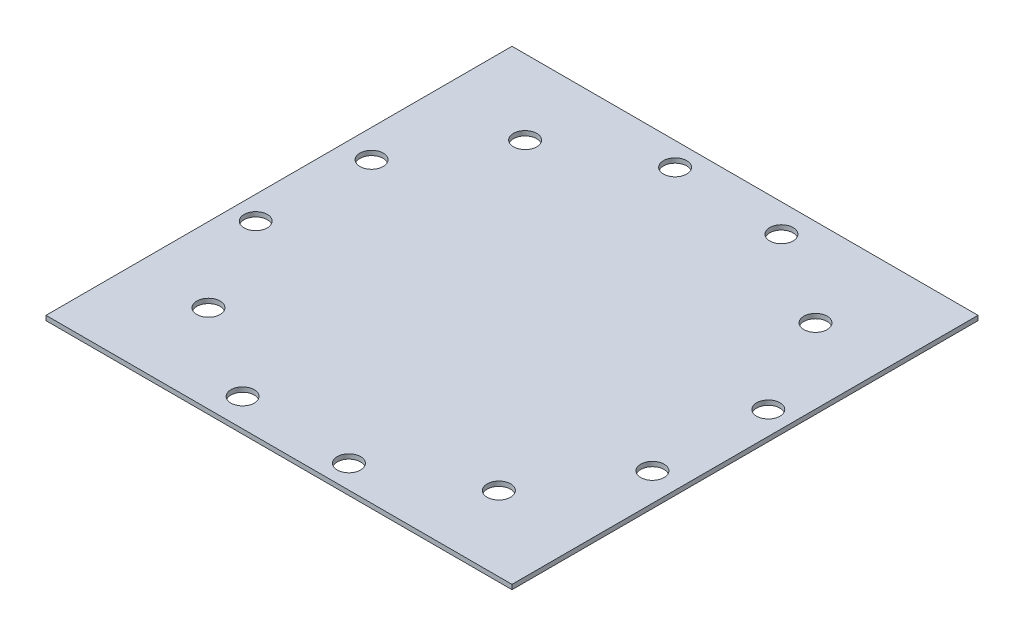
ISO-10303-21;
HEADER;
FILE_DESCRIPTION(('STEP AP214'),'2;1');
FILE_NAME('part.step','',(''),(''),'','','');
FILE_SCHEMA(('AUTOMOTIVE_DESIGN { 1 0 10303 214 1 1 1 1 }'));
ENDSEC;
DATA;
#1=APPLICATION_CONTEXT('core data for automotive mechanical design processes');
#2=APPLICATION_PROTOCOL_DEFINITION('international standard','automotive_design',2000,#1);
#3=PRODUCT_CONTEXT('',#1,'mechanical');
#4=PRODUCT('Part','Part','',(#3));
#5=PRODUCT_RELATED_PRODUCT_CATEGORY('part','',(#4));
#6=PRODUCT_DEFINITION_FORMATION('','',#4);
#7=PRODUCT_DEFINITION_CONTEXT('part definition',#1,'design');
#8=PRODUCT_DEFINITION('design','',#6,#7);
#9=PRODUCT_DEFINITION_SHAPE('','',#8);
#10=(LENGTH_UNIT() NAMED_UNIT(*) SI_UNIT(.MILLI.,.METRE.));
#11=(NAMED_UNIT(*) PLANE_ANGLE_UNIT() SI_UNIT($,.RADIAN.));
#12=(NAMED_UNIT(*) SI_UNIT($,.STERADIAN.) SOLID_ANGLE_UNIT());
#13=UNCERTAINTY_MEASURE_WITH_UNIT(LENGTH_MEASURE(1.E-05),#10,'distance_accuracy_value','');
#14=(GEOMETRIC_REPRESENTATION_CONTEXT(3) GLOBAL_UNCERTAINTY_ASSIGNED_CONTEXT((#13)) GLOBAL_UNIT_ASSIGNED_CONTEXT((#10,
#11,#12)) REPRESENTATION_CONTEXT('',''));
#15=CARTESIAN_POINT('',(0.,0.,0.));
#16=DIRECTION('',(0.,0.,1.));
#17=DIRECTION('',(1.,0.,0.));
#18=AXIS2_PLACEMENT_3D('',#15,#16,#17);
#19=CARTESIAN_POINT('',(-127.,2.54,-127.));
#20=DIRECTION('',(1.,0.,0.));
#21=DIRECTION('',(0.,0.,-1.));
#22=AXIS2_PLACEMENT_3D('',#19,#20,#21);
#23=PLANE('',#22);
#24=DIRECTION('',(0.,0.,1.));
#25=VECTOR('',#24,1.);
#26=CARTESIAN_POINT('',(-127.,0.,-127.));
#27=LINE('',#26,#25);
#28=CARTESIAN_POINT('',(-127.,0.,-127.));
#29=VERTEX_POINT('',#28);
#30=CARTESIAN_POINT('',(-127.,0.,127.));
#31=VERTEX_POINT('',#30);
#32=EDGE_CURVE('E96',#29,#31,#27,.T.);
#33=ORIENTED_EDGE('',*,*,#32,.T.);
#34=DIRECTION('',(0.,-1.,0.));
#35=VECTOR('',#34,1.);
#36=CARTESIAN_POINT('',(-127.,2.54,127.));
#37=LINE('',#36,#35);
#38=CARTESIAN_POINT('',(-127.,2.54,127.));
#39=VERTEX_POINT('',#38);
#40=EDGE_CURVE('E11',#39,#31,#37,.T.);
#41=ORIENTED_EDGE('',*,*,#40,.F.);
#42=DIRECTION('',(0.,0.,1.));
#43=VECTOR('',#42,1.);
#44=CARTESIAN_POINT('',(-127.,2.54,-127.));
#45=LINE('',#44,#43);
#46=CARTESIAN_POINT('',(-127.,2.54,-127.));
#47=VERTEX_POINT('',#46);
#48=EDGE_CURVE('E84',#47,#39,#45,.T.);
#49=ORIENTED_EDGE('',*,*,#48,.F.);
#50=DIRECTION('',(0.,-1.,0.));
#51=VECTOR('',#50,1.);
#52=CARTESIAN_POINT('',(-127.,2.54,-127.));
#53=LINE('',#52,#51);
#54=EDGE_CURVE('E92',#47,#29,#53,.T.);
#55=ORIENTED_EDGE('',*,*,#54,.T.);
#56=EDGE_LOOP('',(#33,#41,#49,#55));
#57=FACE_BOUND('',#56,.T.);
#58=ADVANCED_FACE('F33',(#57),#23,.F.);
#59=CARTESIAN_POINT('',(-127.,2.54,127.));
#60=DIRECTION('',(0.,0.,-1.));
#61=DIRECTION('',(-1.,0.,0.));
#62=AXIS2_PLACEMENT_3D('',#59,#60,#61);
#63=PLANE('',#62);
#64=DIRECTION('',(1.,0.,0.));
#65=VECTOR('',#64,1.);
#66=CARTESIAN_POINT('',(-127.,0.,127.));
#67=LINE('',#66,#65);
#68=CARTESIAN_POINT('',(127.,0.,127.));
#69=VERTEX_POINT('',#68);
#70=EDGE_CURVE('E88',#31,#69,#67,.T.);
#71=ORIENTED_EDGE('',*,*,#70,.T.);
#72=DIRECTION('',(0.,-1.,0.));
#73=VECTOR('',#72,1.);
#74=CARTESIAN_POINT('',(127.,2.54,127.));
#75=LINE('',#74,#73);
#76=CARTESIAN_POINT('',(127.,2.54,127.));
#77=VERTEX_POINT('',#76);
#78=EDGE_CURVE('E41',#77,#69,#75,.T.);
#79=ORIENTED_EDGE('',*,*,#78,.F.);
#80=DIRECTION('',(1.,0.,0.));
#81=VECTOR('',#80,1.);
#82=CARTESIAN_POINT('',(-127.,2.54,127.));
#83=LINE('',#82,#81);
#84=EDGE_CURVE('E79',#39,#77,#83,.T.);
#85=ORIENTED_EDGE('',*,*,#84,.F.);
#86=ORIENTED_EDGE('',*,*,#40,.T.);
#87=EDGE_LOOP('',(#71,#79,#85,#86));
#88=FACE_BOUND('',#87,.T.);
#89=ADVANCED_FACE('F87',(#88),#63,.F.);
#90=CARTESIAN_POINT('',(127.,2.54,-127.));
#91=DIRECTION('',(-1.,0.,0.));
#92=DIRECTION('',(0.,0.,1.));
#93=AXIS2_PLACEMENT_3D('',#90,#91,#92);
#94=PLANE('',#93);
#95=DIRECTION('',(0.,0.,-1.));
#96=VECTOR('',#95,1.);
#97=CARTESIAN_POINT('',(127.,0.,-127.));
#98=LINE('',#97,#96);
#99=CARTESIAN_POINT('',(127.,0.,-127.));
#100=VERTEX_POINT('',#99);
#101=EDGE_CURVE('E66',#69,#100,#98,.T.);
#102=ORIENTED_EDGE('',*,*,#101,.T.);
#103=DIRECTION('',(0.,-1.,0.));
#104=VECTOR('',#103,1.);
#105=CARTESIAN_POINT('',(127.,2.54,-127.));
#106=LINE('',#105,#104);
#107=CARTESIAN_POINT('',(127.,2.54,-127.));
#108=VERTEX_POINT('',#107);
#109=EDGE_CURVE('E89',#108,#100,#106,.T.);
#110=ORIENTED_EDGE('',*,*,#109,.F.);
#111=DIRECTION('',(0.,0.,-1.));
#112=VECTOR('',#111,1.);
#113=CARTESIAN_POINT('',(127.,2.54,-127.));
#114=LINE('',#113,#112);
#115=EDGE_CURVE('E82',#77,#108,#114,.T.);
#116=ORIENTED_EDGE('',*,*,#115,.F.);
#117=ORIENTED_EDGE('',*,*,#78,.T.);
#118=EDGE_LOOP('',(#102,#110,#116,#117));
#119=FACE_BOUND('',#118,.T.);
#120=ADVANCED_FACE('F90',(#119),#94,.F.);
#121=CARTESIAN_POINT('',(-127.,2.54,-127.));
#122=DIRECTION('',(0.,0.,1.));
#123=DIRECTION('',(1.,0.,0.));
#124=AXIS2_PLACEMENT_3D('',#121,#122,#123);
#125=PLANE('',#124);
#126=DIRECTION('',(-1.,0.,0.));
#127=VECTOR('',#126,1.);
#128=CARTESIAN_POINT('',(-127.,0.,-127.));
#129=LINE('',#128,#127);
#130=EDGE_CURVE('E72',#100,#29,#129,.T.);
#131=ORIENTED_EDGE('',*,*,#130,.T.);
#132=ORIENTED_EDGE('',*,*,#54,.F.);
#133=DIRECTION('',(-1.,0.,0.));
#134=VECTOR('',#133,1.);
#135=CARTESIAN_POINT('',(-127.,2.54,-127.));
#136=LINE('',#135,#134);
#137=EDGE_CURVE('E49',#108,#47,#136,.T.);
#138=ORIENTED_EDGE('',*,*,#137,.F.);
#139=ORIENTED_EDGE('',*,*,#109,.T.);
#140=EDGE_LOOP('',(#131,#132,#138,#139));
#141=FACE_BOUND('',#140,.T.);
#142=ADVANCED_FACE('F104',(#141),#125,.F.);
#143=CARTESIAN_POINT('',(0.,2.54,0.));
#144=DIRECTION('',(0.,1.,0.));
#145=DIRECTION('',(0.,0.,1.));
#146=AXIS2_PLACEMENT_3D('',#143,#144,#145);
#147=PLANE('',#146);
#148=CARTESIAN_POINT('',(86.2867036525575,2.54,-79.1470452561229));
#149=DIRECTION('',(0.,1.,0.));
#150=DIRECTION('',(0.,0.,1.));
#151=AXIS2_PLACEMENT_3D('',#148,#149,#150);
#152=CIRCLE('',#151,6.35000000000387);
#153=CARTESIAN_POINT('',(86.2867036525575,2.54,-72.797045256119));
#154=VERTEX_POINT('',#153);
#155=EDGE_CURVE('E176',#154,#154,#152,.T.);
#156=ORIENTED_EDGE('',*,*,#155,.F.);
#157=EDGE_LOOP('',(#156));
#158=FACE_BOUND('',#157,.T.);
#159=CARTESIAN_POINT('',(35.1529547438691,2.54,-111.686703652556));
#160=DIRECTION('',(0.,1.,0.));
#161=DIRECTION('',(0.,0.,1.));
#162=AXIS2_PLACEMENT_3D('',#159,#160,#161);
#163=CIRCLE('',#162,6.35000000000663);
#164=CARTESIAN_POINT('',(35.1529547438691,2.54,-105.336703652549));
#165=VERTEX_POINT('',#164);
#166=EDGE_CURVE('E170',#165,#165,#163,.T.);
#167=ORIENTED_EDGE('',*,*,#166,.F.);
#168=EDGE_LOOP('',(#167));
#169=FACE_BOUND('',#168,.T.);
#170=CARTESIAN_POINT('',(-25.4000000000063,2.54,-114.29999999999));
#171=DIRECTION('',(0.,1.,0.));
#172=DIRECTION('',(0.,0.,1.));
#173=AXIS2_PLACEMENT_3D('',#170,#171,#172);
#174=CIRCLE('',#173,6.35000000000738);
#175=CARTESIAN_POINT('',(-25.4000000000063,2.54,-107.949999999983));
#176=VERTEX_POINT('',#175);
#177=EDGE_CURVE('E164',#176,#176,#174,.T.);
#178=ORIENTED_EDGE('',*,*,#177,.F.);
#179=EDGE_LOOP('',(#178));
#180=FACE_BOUND('',#179,.T.);
#181=CARTESIAN_POINT('',(-79.1470452561291,2.54,-86.2867036525478));
#182=DIRECTION('',(0.,1.,0.));
#183=DIRECTION('',(0.,0.,1.));
#184=AXIS2_PLACEMENT_3D('',#181,#182,#183);
#185=CIRCLE('',#184,6.35000000000596);
#186=CARTESIAN_POINT('',(-79.1470452561291,2.54,-79.9367036525418));
#187=VERTEX_POINT('',#186);
#188=EDGE_CURVE('E158',#187,#187,#185,.T.);
#189=ORIENTED_EDGE('',*,*,#188,.F.);
#190=EDGE_LOOP('',(#189));
#191=FACE_BOUND('',#190,.T.);
#192=CARTESIAN_POINT('',(-111.686703652562,2.54,-35.1529547438594));
#193=DIRECTION('',(0.,1.,0.));
#194=DIRECTION('',(0.,0.,1.));
#195=AXIS2_PLACEMENT_3D('',#192,#193,#194);
#196=CIRCLE('',#195,6.35000000000278);
#197=CARTESIAN_POINT('',(-111.686703652562,2.54,-28.8029547438566));
#198=VERTEX_POINT('',#197);
#199=EDGE_CURVE('E152',#198,#198,#196,.T.);
#200=ORIENTED_EDGE('',*,*,#199,.F.);
#201=EDGE_LOOP('',(#200));
#202=FACE_BOUND('',#201,.T.);
#203=CARTESIAN_POINT('',(-114.299999999997,2.54,25.400000000016));
#204=DIRECTION('',(0.,1.,0.));
#205=DIRECTION('',(0.,0.,1.));
#206=AXIS2_PLACEMENT_3D('',#203,#204,#205);
#207=CIRCLE('',#206,6.34999999999859);
#208=CARTESIAN_POINT('',(-114.299999999997,2.54,31.7500000000146));
#209=VERTEX_POINT('',#208);
#210=EDGE_CURVE('E146',#209,#209,#207,.T.);
#211=ORIENTED_EDGE('',*,*,#210,.F.);
#212=EDGE_LOOP('',(#211));
#213=FACE_BOUND('',#212,.T.);
#214=CARTESIAN_POINT('',(-86.2867036525541,2.54,79.1470452561389));
#215=DIRECTION('',(0.,1.,0.));
#216=DIRECTION('',(0.,0.,1.));
#217=AXIS2_PLACEMENT_3D('',#214,#215,#216);
#218=CIRCLE('',#217,6.34999999999458);
#219=CARTESIAN_POINT('',(-86.2867036525541,2.54,85.4970452561334));
#220=VERTEX_POINT('',#219);
#221=EDGE_CURVE('E140',#220,#220,#218,.T.);
#222=ORIENTED_EDGE('',*,*,#221,.F.);
#223=EDGE_LOOP('',(#222));
#224=FACE_BOUND('',#223,.T.);
#225=CARTESIAN_POINT('',(-35.1529547438657,2.54,111.686703652572));
#226=DIRECTION('',(0.,1.,0.));
#227=DIRECTION('',(0.,0.,1.));
#228=AXIS2_PLACEMENT_3D('',#225,#226,#227);
#229=CIRCLE('',#228,6.3499999999918);
#230=CARTESIAN_POINT('',(-35.1529547438657,2.54,118.036703652564));
#231=VERTEX_POINT('',#230);
#232=EDGE_CURVE('E134',#231,#231,#229,.T.);
#233=ORIENTED_EDGE('',*,*,#232,.F.);
#234=EDGE_LOOP('',(#233));
#235=FACE_BOUND('',#234,.T.);
#236=CARTESIAN_POINT('',(25.4000000000098,2.54,114.300000000006));
#237=DIRECTION('',(0.,1.,0.));
#238=DIRECTION('',(0.,0.,1.));
#239=AXIS2_PLACEMENT_3D('',#236,#237,#238);
#240=CIRCLE('',#239,6.34999999999111);
#241=CARTESIAN_POINT('',(25.4000000000098,2.54,120.649999999997));
#242=VERTEX_POINT('',#241);
#243=EDGE_CURVE('E128',#242,#242,#240,.T.);
#244=ORIENTED_EDGE('',*,*,#243,.F.);
#245=EDGE_LOOP('',(#244));
#246=FACE_BOUND('',#245,.T.);
#247=CARTESIAN_POINT('',(79.1470452561326,2.54,86.2867036525638));
#248=DIRECTION('',(0.,1.,0.));
#249=DIRECTION('',(0.,0.,1.));
#250=AXIS2_PLACEMENT_3D('',#247,#248,#249);
#251=CIRCLE('',#250,6.34999999999258);
#252=CARTESIAN_POINT('',(79.1470452561326,2.54,92.6367036525564));
#253=VERTEX_POINT('',#252);
#254=EDGE_CURVE('E122',#253,#253,#251,.T.);
#255=ORIENTED_EDGE('',*,*,#254,.F.);
#256=EDGE_LOOP('',(#255));
#257=FACE_BOUND('',#256,.T.);
#258=CARTESIAN_POINT('',(111.686703652566,2.54,35.1529547438755));
#259=DIRECTION('',(0.,1.,0.));
#260=DIRECTION('',(0.,0.,1.));
#261=AXIS2_PLACEMENT_3D('',#258,#259,#260);
#262=CIRCLE('',#261,6.34999999999583);
#263=CARTESIAN_POINT('',(111.686703652566,2.54,41.5029547438713));
#264=VERTEX_POINT('',#263);
#265=EDGE_CURVE('E116',#264,#264,#262,.T.);
#266=ORIENTED_EDGE('',*,*,#265,.F.);
#267=EDGE_LOOP('',(#266));
#268=FACE_BOUND('',#267,.T.);
#269=CARTESIAN_POINT('',(114.3,2.54,-25.4));
#270=DIRECTION('',(0.,1.,0.));
#271=DIRECTION('',(0.,0.,1.));
#272=AXIS2_PLACEMENT_3D('',#269,#270,#271);
#273=CIRCLE('',#272,6.35);
#274=CARTESIAN_POINT('',(114.3,2.54,-19.05));
#275=VERTEX_POINT('',#274);
#276=EDGE_CURVE('E110',#275,#275,#273,.T.);
#277=ORIENTED_EDGE('',*,*,#276,.F.);
#278=EDGE_LOOP('',(#277));
#279=FACE_BOUND('',#278,.T.);
#280=ORIENTED_EDGE('',*,*,#48,.T.);
#281=ORIENTED_EDGE('',*,*,#84,.T.);
#282=ORIENTED_EDGE('',*,*,#115,.T.);
#283=ORIENTED_EDGE('',*,*,#137,.T.);
#284=EDGE_LOOP('',(#280,#281,#282,#283));
#285=FACE_BOUND('',#284,.T.);
#286=ADVANCED_FACE('F80',(#158,#169,#180,#191,#202,#213,#224,#235,#246,#257,#268,#279,#285),
#147,.T.);
#287=CARTESIAN_POINT('',(0.,0.,0.));
#288=DIRECTION('',(0.,1.,0.));
#289=DIRECTION('',(0.,0.,1.));
#290=AXIS2_PLACEMENT_3D('',#287,#288,#289);
#291=PLANE('',#290);
#292=CARTESIAN_POINT('',(86.2867036525575,0.,-79.1470452561229));
#293=DIRECTION('',(0.,1.,0.));
#294=DIRECTION('',(0.,0.,1.));
#295=AXIS2_PLACEMENT_3D('',#292,#293,#294);
#296=CIRCLE('',#295,6.35000000000387);
#297=CARTESIAN_POINT('',(86.2867036525575,0.,-72.797045256119));
#298=VERTEX_POINT('',#297);
#299=EDGE_CURVE('E173',#298,#298,#296,.T.);
#300=ORIENTED_EDGE('',*,*,#299,.T.);
#301=EDGE_LOOP('',(#300));
#302=FACE_BOUND('',#301,.T.);
#303=CARTESIAN_POINT('',(35.1529547438691,0.,-111.686703652556));
#304=DIRECTION('',(0.,1.,0.));
#305=DIRECTION('',(0.,0.,1.));
#306=AXIS2_PLACEMENT_3D('',#303,#304,#305);
#307=CIRCLE('',#306,6.35000000000663);
#308=CARTESIAN_POINT('',(35.1529547438691,0.,-105.336703652549));
#309=VERTEX_POINT('',#308);
#310=EDGE_CURVE('E167',#309,#309,#307,.T.);
#311=ORIENTED_EDGE('',*,*,#310,.T.);
#312=EDGE_LOOP('',(#311));
#313=FACE_BOUND('',#312,.T.);
#314=CARTESIAN_POINT('',(-25.4000000000063,0.,-114.29999999999));
#315=DIRECTION('',(0.,1.,0.));
#316=DIRECTION('',(0.,0.,1.));
#317=AXIS2_PLACEMENT_3D('',#314,#315,#316);
#318=CIRCLE('',#317,6.35000000000738);
#319=CARTESIAN_POINT('',(-25.4000000000063,0.,-107.949999999983));
#320=VERTEX_POINT('',#319);
#321=EDGE_CURVE('E161',#320,#320,#318,.T.);
#322=ORIENTED_EDGE('',*,*,#321,.T.);
#323=EDGE_LOOP('',(#322));
#324=FACE_BOUND('',#323,.T.);
#325=CARTESIAN_POINT('',(-79.1470452561291,0.,-86.2867036525478));
#326=DIRECTION('',(0.,1.,0.));
#327=DIRECTION('',(0.,0.,1.));
#328=AXIS2_PLACEMENT_3D('',#325,#326,#327);
#329=CIRCLE('',#328,6.35000000000596);
#330=CARTESIAN_POINT('',(-79.1470452561291,0.,-79.9367036525418));
#331=VERTEX_POINT('',#330);
#332=EDGE_CURVE('E155',#331,#331,#329,.T.);
#333=ORIENTED_EDGE('',*,*,#332,.T.);
#334=EDGE_LOOP('',(#333));
#335=FACE_BOUND('',#334,.T.);
#336=CARTESIAN_POINT('',(-111.686703652562,0.,-35.1529547438594));
#337=DIRECTION('',(0.,1.,0.));
#338=DIRECTION('',(0.,0.,1.));
#339=AXIS2_PLACEMENT_3D('',#336,#337,#338);
#340=CIRCLE('',#339,6.35000000000278);
#341=CARTESIAN_POINT('',(-111.686703652562,0.,-28.8029547438566));
#342=VERTEX_POINT('',#341);
#343=EDGE_CURVE('E149',#342,#342,#340,.T.);
#344=ORIENTED_EDGE('',*,*,#343,.T.);
#345=EDGE_LOOP('',(#344));
#346=FACE_BOUND('',#345,.T.);
#347=CARTESIAN_POINT('',(-114.299999999997,0.,25.400000000016));
#348=DIRECTION('',(0.,1.,0.));
#349=DIRECTION('',(0.,0.,1.));
#350=AXIS2_PLACEMENT_3D('',#347,#348,#349);
#351=CIRCLE('',#350,6.34999999999859);
#352=CARTESIAN_POINT('',(-114.299999999997,0.,31.7500000000146));
#353=VERTEX_POINT('',#352);
#354=EDGE_CURVE('E143',#353,#353,#351,.T.);
#355=ORIENTED_EDGE('',*,*,#354,.T.);
#356=EDGE_LOOP('',(#355));
#357=FACE_BOUND('',#356,.T.);
#358=CARTESIAN_POINT('',(-86.2867036525541,0.,79.1470452561389));
#359=DIRECTION('',(0.,1.,0.));
#360=DIRECTION('',(0.,0.,1.));
#361=AXIS2_PLACEMENT_3D('',#358,#359,#360);
#362=CIRCLE('',#361,6.34999999999458);
#363=CARTESIAN_POINT('',(-86.2867036525541,0.,85.4970452561334));
#364=VERTEX_POINT('',#363);
#365=EDGE_CURVE('E137',#364,#364,#362,.T.);
#366=ORIENTED_EDGE('',*,*,#365,.T.);
#367=EDGE_LOOP('',(#366));
#368=FACE_BOUND('',#367,.T.);
#369=CARTESIAN_POINT('',(-35.1529547438657,0.,111.686703652572));
#370=DIRECTION('',(0.,1.,0.));
#371=DIRECTION('',(0.,0.,1.));
#372=AXIS2_PLACEMENT_3D('',#369,#370,#371);
#373=CIRCLE('',#372,6.3499999999918);
#374=CARTESIAN_POINT('',(-35.1529547438657,0.,118.036703652564));
#375=VERTEX_POINT('',#374);
#376=EDGE_CURVE('E131',#375,#375,#373,.T.);
#377=ORIENTED_EDGE('',*,*,#376,.T.);
#378=EDGE_LOOP('',(#377));
#379=FACE_BOUND('',#378,.T.);
#380=CARTESIAN_POINT('',(25.4000000000098,0.,114.300000000006));
#381=DIRECTION('',(0.,1.,0.));
#382=DIRECTION('',(0.,0.,1.));
#383=AXIS2_PLACEMENT_3D('',#380,#381,#382);
#384=CIRCLE('',#383,6.34999999999111);
#385=CARTESIAN_POINT('',(25.4000000000098,0.,120.649999999997));
#386=VERTEX_POINT('',#385);
#387=EDGE_CURVE('E125',#386,#386,#384,.T.);
#388=ORIENTED_EDGE('',*,*,#387,.T.);
#389=EDGE_LOOP('',(#388));
#390=FACE_BOUND('',#389,.T.);
#391=CARTESIAN_POINT('',(79.1470452561326,0.,86.2867036525638));
#392=DIRECTION('',(0.,1.,0.));
#393=DIRECTION('',(0.,0.,1.));
#394=AXIS2_PLACEMENT_3D('',#391,#392,#393);
#395=CIRCLE('',#394,6.34999999999258);
#396=CARTESIAN_POINT('',(79.1470452561326,0.,92.6367036525564));
#397=VERTEX_POINT('',#396);
#398=EDGE_CURVE('E119',#397,#397,#395,.T.);
#399=ORIENTED_EDGE('',*,*,#398,.T.);
#400=EDGE_LOOP('',(#399));
#401=FACE_BOUND('',#400,.T.);
#402=CARTESIAN_POINT('',(111.686703652566,0.,35.1529547438755));
#403=DIRECTION('',(0.,1.,0.));
#404=DIRECTION('',(0.,0.,1.));
#405=AXIS2_PLACEMENT_3D('',#402,#403,#404);
#406=CIRCLE('',#405,6.34999999999583);
#407=CARTESIAN_POINT('',(111.686703652566,0.,41.5029547438713));
#408=VERTEX_POINT('',#407);
#409=EDGE_CURVE('E113',#408,#408,#406,.T.);
#410=ORIENTED_EDGE('',*,*,#409,.T.);
#411=EDGE_LOOP('',(#410));
#412=FACE_BOUND('',#411,.T.);
#413=CARTESIAN_POINT('',(114.3,0.,-25.4));
#414=DIRECTION('',(0.,1.,0.));
#415=DIRECTION('',(0.,0.,1.));
#416=AXIS2_PLACEMENT_3D('',#413,#414,#415);
#417=CIRCLE('',#416,6.35);
#418=CARTESIAN_POINT('',(114.3,0.,-19.05));
#419=VERTEX_POINT('',#418);
#420=EDGE_CURVE('E99',#419,#419,#417,.T.);
#421=ORIENTED_EDGE('',*,*,#420,.T.);
#422=EDGE_LOOP('',(#421));
#423=FACE_BOUND('',#422,.T.);
#424=ORIENTED_EDGE('',*,*,#32,.F.);
#425=ORIENTED_EDGE('',*,*,#130,.F.);
#426=ORIENTED_EDGE('',*,*,#101,.F.);
#427=ORIENTED_EDGE('',*,*,#70,.F.);
#428=EDGE_LOOP('',(#424,#425,#426,#427));
#429=FACE_BOUND('',#428,.T.);
#430=ADVANCED_FACE('F107',(#302,#313,#324,#335,#346,#357,#368,#379,#390,#401,#412,#423,#429),
#291,.F.);
#431=CARTESIAN_POINT('',(114.3,0.,-25.4));
#432=DIRECTION('',(0.,1.,0.));
#433=DIRECTION('',(0.,0.,1.));
#434=AXIS2_PLACEMENT_3D('',#431,#432,#433);
#435=CYLINDRICAL_SURFACE('',#434,6.35);
#436=ORIENTED_EDGE('',*,*,#420,.F.);
#437=EDGE_LOOP('',(#436));
#438=FACE_BOUND('',#437,.T.);
#439=ORIENTED_EDGE('',*,*,#276,.T.);
#440=EDGE_LOOP('',(#439));
#441=FACE_BOUND('',#440,.T.);
#442=ADVANCED_FACE('F216',(#438,#441),#435,.F.);
#443=CARTESIAN_POINT('',(111.686703652566,0.,35.1529547438755));
#444=DIRECTION('',(0.,1.,0.));
#445=DIRECTION('',(0.,0.,1.));
#446=AXIS2_PLACEMENT_3D('',#443,#444,#445);
#447=CYLINDRICAL_SURFACE('',#446,6.34999999999583);
#448=ORIENTED_EDGE('',*,*,#409,.F.);
#449=EDGE_LOOP('',(#448));
#450=FACE_BOUND('',#449,.T.);
#451=ORIENTED_EDGE('',*,*,#265,.T.);
#452=EDGE_LOOP('',(#451));
#453=FACE_BOUND('',#452,.T.);
#454=ADVANCED_FACE('F218',(#450,#453),#447,.F.);
#455=CARTESIAN_POINT('',(79.1470452561326,0.,86.2867036525638));
#456=DIRECTION('',(0.,1.,0.));
#457=DIRECTION('',(0.,0.,1.));
#458=AXIS2_PLACEMENT_3D('',#455,#456,#457);
#459=CYLINDRICAL_SURFACE('',#458,6.34999999999258);
#460=ORIENTED_EDGE('',*,*,#398,.F.);
#461=EDGE_LOOP('',(#460));
#462=FACE_BOUND('',#461,.T.);
#463=ORIENTED_EDGE('',*,*,#254,.T.);
#464=EDGE_LOOP('',(#463));
#465=FACE_BOUND('',#464,.T.);
#466=ADVANCED_FACE('F225',(#462,#465),#459,.F.);
#467=CARTESIAN_POINT('',(25.4000000000098,0.,114.300000000006));
#468=DIRECTION('',(0.,1.,0.));
#469=DIRECTION('',(0.,0.,1.));
#470=AXIS2_PLACEMENT_3D('',#467,#468,#469);
#471=CYLINDRICAL_SURFACE('',#470,6.34999999999111);
#472=ORIENTED_EDGE('',*,*,#387,.F.);
#473=EDGE_LOOP('',(#472));
#474=FACE_BOUND('',#473,.T.);
#475=ORIENTED_EDGE('',*,*,#243,.T.);
#476=EDGE_LOOP('',(#475));
#477=FACE_BOUND('',#476,.T.);
#478=ADVANCED_FACE('F271',(#474,#477),#471,.F.);
#479=CARTESIAN_POINT('',(-35.1529547438657,0.,111.686703652572));
#480=DIRECTION('',(0.,1.,0.));
#481=DIRECTION('',(0.,0.,1.));
#482=AXIS2_PLACEMENT_3D('',#479,#480,#481);
#483=CYLINDRICAL_SURFACE('',#482,6.3499999999918);
#484=ORIENTED_EDGE('',*,*,#376,.F.);
#485=EDGE_LOOP('',(#484));
#486=FACE_BOUND('',#485,.T.);
#487=ORIENTED_EDGE('',*,*,#232,.T.);
#488=EDGE_LOOP('',(#487));
#489=FACE_BOUND('',#488,.T.);
#490=ADVANCED_FACE('F281',(#486,#489),#483,.F.);
#491=CARTESIAN_POINT('',(-86.2867036525541,0.,79.1470452561389));
#492=DIRECTION('',(0.,1.,0.));
#493=DIRECTION('',(0.,0.,1.));
#494=AXIS2_PLACEMENT_3D('',#491,#492,#493);
#495=CYLINDRICAL_SURFACE('',#494,6.34999999999458);
#496=ORIENTED_EDGE('',*,*,#365,.F.);
#497=EDGE_LOOP('',(#496));
#498=FACE_BOUND('',#497,.T.);
#499=ORIENTED_EDGE('',*,*,#221,.T.);
#500=EDGE_LOOP('',(#499));
#501=FACE_BOUND('',#500,.T.);
#502=ADVANCED_FACE('F291',(#498,#501),#495,.F.);
#503=CARTESIAN_POINT('',(-114.299999999997,0.,25.400000000016));
#504=DIRECTION('',(0.,1.,0.));
#505=DIRECTION('',(0.,0.,1.));
#506=AXIS2_PLACEMENT_3D('',#503,#504,#505);
#507=CYLINDRICAL_SURFACE('',#506,6.34999999999859);
#508=ORIENTED_EDGE('',*,*,#354,.F.);
#509=EDGE_LOOP('',(#508));
#510=FACE_BOUND('',#509,.T.);
#511=ORIENTED_EDGE('',*,*,#210,.T.);
#512=EDGE_LOOP('',(#511));
#513=FACE_BOUND('',#512,.T.);
#514=ADVANCED_FACE('F301',(#510,#513),#507,.F.);
#515=CARTESIAN_POINT('',(-111.686703652562,0.,-35.1529547438594));
#516=DIRECTION('',(0.,1.,0.));
#517=DIRECTION('',(0.,0.,1.));
#518=AXIS2_PLACEMENT_3D('',#515,#516,#517);
#519=CYLINDRICAL_SURFACE('',#518,6.35000000000278);
#520=ORIENTED_EDGE('',*,*,#343,.F.);
#521=EDGE_LOOP('',(#520));
#522=FACE_BOUND('',#521,.T.);
#523=ORIENTED_EDGE('',*,*,#199,.T.);
#524=EDGE_LOOP('',(#523));
#525=FACE_BOUND('',#524,.T.);
#526=ADVANCED_FACE('F311',(#522,#525),#519,.F.);
#527=CARTESIAN_POINT('',(-79.1470452561291,0.,-86.2867036525478));
#528=DIRECTION('',(0.,1.,0.));
#529=DIRECTION('',(0.,0.,1.));
#530=AXIS2_PLACEMENT_3D('',#527,#528,#529);
#531=CYLINDRICAL_SURFACE('',#530,6.35000000000596);
#532=ORIENTED_EDGE('',*,*,#332,.F.);
#533=EDGE_LOOP('',(#532));
#534=FACE_BOUND('',#533,.T.);
#535=ORIENTED_EDGE('',*,*,#188,.T.);
#536=EDGE_LOOP('',(#535));
#537=FACE_BOUND('',#536,.T.);
#538=ADVANCED_FACE('F321',(#534,#537),#531,.F.);
#539=CARTESIAN_POINT('',(-25.4000000000063,0.,-114.29999999999));
#540=DIRECTION('',(0.,1.,0.));
#541=DIRECTION('',(0.,0.,1.));
#542=AXIS2_PLACEMENT_3D('',#539,#540,#541);
#543=CYLINDRICAL_SURFACE('',#542,6.35000000000738);
#544=ORIENTED_EDGE('',*,*,#321,.F.);
#545=EDGE_LOOP('',(#544));
#546=FACE_BOUND('',#545,.T.);
#547=ORIENTED_EDGE('',*,*,#177,.T.);
#548=EDGE_LOOP('',(#547));
#549=FACE_BOUND('',#548,.T.);
#550=ADVANCED_FACE('F331',(#546,#549),#543,.F.);
#551=CARTESIAN_POINT('',(35.1529547438691,0.,-111.686703652556));
#552=DIRECTION('',(0.,1.,0.));
#553=DIRECTION('',(0.,0.,1.));
#554=AXIS2_PLACEMENT_3D('',#551,#552,#553);
#555=CYLINDRICAL_SURFACE('',#554,6.35000000000663);
#556=ORIENTED_EDGE('',*,*,#310,.F.);
#557=EDGE_LOOP('',(#556));
#558=FACE_BOUND('',#557,.T.);
#559=ORIENTED_EDGE('',*,*,#166,.T.);
#560=EDGE_LOOP('',(#559));
#561=FACE_BOUND('',#560,.T.);
#562=ADVANCED_FACE('F187',(#558,#561),#555,.F.);
#563=CARTESIAN_POINT('',(86.2867036525575,0.,-79.1470452561229));
#564=DIRECTION('',(0.,1.,0.));
#565=DIRECTION('',(0.,0.,1.));
#566=AXIS2_PLACEMENT_3D('',#563,#564,#565);
#567=CYLINDRICAL_SURFACE('',#566,6.35000000000387);
#568=ORIENTED_EDGE('',*,*,#299,.F.);
#569=EDGE_LOOP('',(#568));
#570=FACE_BOUND('',#569,.T.);
#571=ORIENTED_EDGE('',*,*,#155,.T.);
#572=EDGE_LOOP('',(#571));
#573=FACE_BOUND('',#572,.T.);
#574=ADVANCED_FACE('F184',(#570,#573),#567,.F.);
#575=CLOSED_SHELL('',(#58,#89,#120,#142,#286,#430,#442,#454,#466,#478,#490,#502,#514,#526,#538,
#550,#562,#574));
#576=MANIFOLD_SOLID_BREP('B2',#575);
#577=ADVANCED_BREP_SHAPE_REPRESENTATION('',(#18,#576),#14);
#578=SHAPE_DEFINITION_REPRESENTATION(#9,#577);
ENDSEC;
END-ISO-10303-21;
